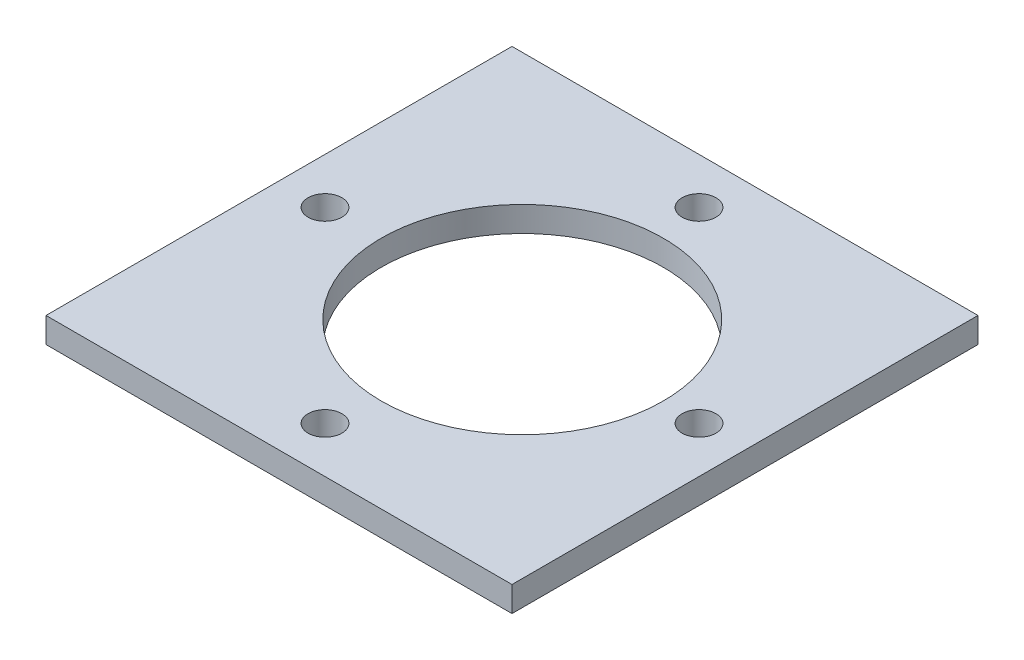
ISO-10303-21;
HEADER;
FILE_DESCRIPTION(('STEP AP214'),'2;1');
FILE_NAME('part.step','',(''),(''),'','','');
FILE_SCHEMA(('AUTOMOTIVE_DESIGN { 1 0 10303 214 1 1 1 1 }'));
ENDSEC;
DATA;
#1=APPLICATION_CONTEXT('core data for automotive mechanical design processes');
#2=APPLICATION_PROTOCOL_DEFINITION('international standard','automotive_design',2000,#1);
#3=PRODUCT_CONTEXT('',#1,'mechanical');
#4=PRODUCT('Part','Part','',(#3));
#5=PRODUCT_RELATED_PRODUCT_CATEGORY('part','',(#4));
#6=PRODUCT_DEFINITION_FORMATION('','',#4);
#7=PRODUCT_DEFINITION_CONTEXT('part definition',#1,'design');
#8=PRODUCT_DEFINITION('design','',#6,#7);
#9=PRODUCT_DEFINITION_SHAPE('','',#8);
#10=(LENGTH_UNIT() NAMED_UNIT(*) SI_UNIT(.MILLI.,.METRE.));
#11=(NAMED_UNIT(*) PLANE_ANGLE_UNIT() SI_UNIT($,.RADIAN.));
#12=(NAMED_UNIT(*) SI_UNIT($,.STERADIAN.) SOLID_ANGLE_UNIT());
#13=UNCERTAINTY_MEASURE_WITH_UNIT(LENGTH_MEASURE(1.E-05),#10,'distance_accuracy_value','');
#14=(GEOMETRIC_REPRESENTATION_CONTEXT(3) GLOBAL_UNCERTAINTY_ASSIGNED_CONTEXT((#13)) GLOBAL_UNIT_ASSIGNED_CONTEXT((#10,
#11,#12)) REPRESENTATION_CONTEXT('',''));
#15=CARTESIAN_POINT('',(0.,0.,0.));
#16=DIRECTION('',(0.,0.,1.));
#17=DIRECTION('',(1.,0.,0.));
#18=AXIS2_PLACEMENT_3D('',#15,#16,#17);
#19=CARTESIAN_POINT('',(0.,4.47,0.));
#20=DIRECTION('',(1.,0.,0.));
#21=DIRECTION('',(0.,0.,-1.));
#22=AXIS2_PLACEMENT_3D('',#19,#20,#21);
#23=PLANE('',#22);
#24=DIRECTION('',(0.,0.,1.));
#25=VECTOR('',#24,1.);
#26=CARTESIAN_POINT('',(0.,0.,0.));
#27=LINE('',#26,#25);
#28=CARTESIAN_POINT('',(0.,0.,-82.6));
#29=VERTEX_POINT('',#28);
#30=CARTESIAN_POINT('',(0.,0.,0.));
#31=VERTEX_POINT('',#30);
#32=EDGE_CURVE('E102',#29,#31,#27,.T.);
#33=ORIENTED_EDGE('',*,*,#32,.T.);
#34=DIRECTION('',(0.,-1.,0.));
#35=VECTOR('',#34,1.);
#36=CARTESIAN_POINT('',(0.,4.47,0.));
#37=LINE('',#36,#35);
#38=CARTESIAN_POINT('',(0.,4.47,0.));
#39=VERTEX_POINT('',#38);
#40=EDGE_CURVE('E11',#39,#31,#37,.T.);
#41=ORIENTED_EDGE('',*,*,#40,.F.);
#42=DIRECTION('',(0.,0.,1.));
#43=VECTOR('',#42,1.);
#44=CARTESIAN_POINT('',(0.,4.47,0.));
#45=LINE('',#44,#43);
#46=CARTESIAN_POINT('',(0.,4.47,-82.6));
#47=VERTEX_POINT('',#46);
#48=EDGE_CURVE('E90',#47,#39,#45,.T.);
#49=ORIENTED_EDGE('',*,*,#48,.F.);
#50=DIRECTION('',(0.,-1.,0.));
#51=VECTOR('',#50,1.);
#52=CARTESIAN_POINT('',(0.,4.47,-82.6));
#53=LINE('',#52,#51);
#54=EDGE_CURVE('E98',#47,#29,#53,.T.);
#55=ORIENTED_EDGE('',*,*,#54,.T.);
#56=EDGE_LOOP('',(#33,#41,#49,#55));
#57=FACE_BOUND('',#56,.T.);
#58=ADVANCED_FACE('F39',(#57),#23,.F.);
#59=CARTESIAN_POINT('',(0.,4.47,0.));
#60=DIRECTION('',(0.,0.,-1.));
#61=DIRECTION('',(-1.,0.,0.));
#62=AXIS2_PLACEMENT_3D('',#59,#60,#61);
#63=PLANE('',#62);
#64=DIRECTION('',(1.,0.,0.));
#65=VECTOR('',#64,1.);
#66=CARTESIAN_POINT('',(0.,0.,0.));
#67=LINE('',#66,#65);
#68=CARTESIAN_POINT('',(82.6,0.,0.));
#69=VERTEX_POINT('',#68);
#70=EDGE_CURVE('E94',#31,#69,#67,.T.);
#71=ORIENTED_EDGE('',*,*,#70,.T.);
#72=DIRECTION('',(0.,-1.,0.));
#73=VECTOR('',#72,1.);
#74=CARTESIAN_POINT('',(82.6,4.47,0.));
#75=LINE('',#74,#73);
#76=CARTESIAN_POINT('',(82.6,4.47,0.));
#77=VERTEX_POINT('',#76);
#78=EDGE_CURVE('E47',#77,#69,#75,.T.);
#79=ORIENTED_EDGE('',*,*,#78,.F.);
#80=DIRECTION('',(1.,0.,0.));
#81=VECTOR('',#80,1.);
#82=CARTESIAN_POINT('',(0.,4.47,0.));
#83=LINE('',#82,#81);
#84=EDGE_CURVE('E85',#39,#77,#83,.T.);
#85=ORIENTED_EDGE('',*,*,#84,.F.);
#86=ORIENTED_EDGE('',*,*,#40,.T.);
#87=EDGE_LOOP('',(#71,#79,#85,#86));
#88=FACE_BOUND('',#87,.T.);
#89=ADVANCED_FACE('F93',(#88),#63,.F.);
#90=CARTESIAN_POINT('',(82.6,4.47,0.));
#91=DIRECTION('',(-1.,0.,0.));
#92=DIRECTION('',(0.,0.,1.));
#93=AXIS2_PLACEMENT_3D('',#90,#91,#92);
#94=PLANE('',#93);
#95=DIRECTION('',(0.,0.,-1.));
#96=VECTOR('',#95,1.);
#97=CARTESIAN_POINT('',(82.6,0.,0.));
#98=LINE('',#97,#96);
#99=CARTESIAN_POINT('',(82.6,0.,-82.6));
#100=VERTEX_POINT('',#99);
#101=EDGE_CURVE('E72',#69,#100,#98,.T.);
#102=ORIENTED_EDGE('',*,*,#101,.T.);
#103=DIRECTION('',(0.,-1.,0.));
#104=VECTOR('',#103,1.);
#105=CARTESIAN_POINT('',(82.6,4.47,-82.6));
#106=LINE('',#105,#104);
#107=CARTESIAN_POINT('',(82.6,4.47,-82.6));
#108=VERTEX_POINT('',#107);
#109=EDGE_CURVE('E95',#108,#100,#106,.T.);
#110=ORIENTED_EDGE('',*,*,#109,.F.);
#111=DIRECTION('',(0.,0.,-1.));
#112=VECTOR('',#111,1.);
#113=CARTESIAN_POINT('',(82.6,4.47,0.));
#114=LINE('',#113,#112);
#115=EDGE_CURVE('E88',#77,#108,#114,.T.);
#116=ORIENTED_EDGE('',*,*,#115,.F.);
#117=ORIENTED_EDGE('',*,*,#78,.T.);
#118=EDGE_LOOP('',(#102,#110,#116,#117));
#119=FACE_BOUND('',#118,.T.);
#120=ADVANCED_FACE('F96',(#119),#94,.F.);
#121=CARTESIAN_POINT('',(0.,4.47,-82.6));
#122=DIRECTION('',(0.,0.,1.));
#123=DIRECTION('',(1.,0.,0.));
#124=AXIS2_PLACEMENT_3D('',#121,#122,#123);
#125=PLANE('',#124);
#126=DIRECTION('',(-1.,0.,0.));
#127=VECTOR('',#126,1.);
#128=CARTESIAN_POINT('',(0.,0.,-82.6));
#129=LINE('',#128,#127);
#130=EDGE_CURVE('E78',#100,#29,#129,.T.);
#131=ORIENTED_EDGE('',*,*,#130,.T.);
#132=ORIENTED_EDGE('',*,*,#54,.F.);
#133=DIRECTION('',(-1.,0.,0.));
#134=VECTOR('',#133,1.);
#135=CARTESIAN_POINT('',(0.,4.47,-82.6));
#136=LINE('',#135,#134);
#137=EDGE_CURVE('E55',#108,#47,#136,.T.);
#138=ORIENTED_EDGE('',*,*,#137,.F.);
#139=ORIENTED_EDGE('',*,*,#109,.T.);
#140=EDGE_LOOP('',(#131,#132,#138,#139));
#141=FACE_BOUND('',#140,.T.);
#142=ADVANCED_FACE('F110',(#141),#125,.F.);
#143=CARTESIAN_POINT('',(0.,4.47,0.));
#144=DIRECTION('',(0.,-1.,0.));
#145=DIRECTION('',(0.,0.,-1.));
#146=AXIS2_PLACEMENT_3D('',#143,#144,#145);
#147=PLANE('',#146);
#148=CARTESIAN_POINT('',(8.15,4.47,-41.3));
#149=DIRECTION('',(0.,1.,0.));
#150=DIRECTION('',(0.,0.,1.));
#151=AXIS2_PLACEMENT_3D('',#148,#149,#150);
#152=CIRCLE('',#151,3.);
#153=CARTESIAN_POINT('',(8.15,4.47,-38.3));
#154=VERTEX_POINT('',#153);
#155=EDGE_CURVE('E140',#154,#154,#152,.T.);
#156=ORIENTED_EDGE('',*,*,#155,.F.);
#157=EDGE_LOOP('',(#156));
#158=FACE_BOUND('',#157,.T.);
#159=CARTESIAN_POINT('',(41.3,4.47,-74.45));
#160=DIRECTION('',(0.,1.,0.));
#161=DIRECTION('',(0.,0.,1.));
#162=AXIS2_PLACEMENT_3D('',#159,#160,#161);
#163=CIRCLE('',#162,3.);
#164=CARTESIAN_POINT('',(41.3,4.47,-71.45));
#165=VERTEX_POINT('',#164);
#166=EDGE_CURVE('E137',#165,#165,#163,.T.);
#167=ORIENTED_EDGE('',*,*,#166,.F.);
#168=EDGE_LOOP('',(#167));
#169=FACE_BOUND('',#168,.T.);
#170=CARTESIAN_POINT('',(74.45,4.47,-41.3));
#171=DIRECTION('',(0.,1.,0.));
#172=DIRECTION('',(0.,0.,1.));
#173=AXIS2_PLACEMENT_3D('',#170,#171,#172);
#174=CIRCLE('',#173,3.00000000000001);
#175=CARTESIAN_POINT('',(74.45,4.47,-38.3));
#176=VERTEX_POINT('',#175);
#177=EDGE_CURVE('E131',#176,#176,#174,.T.);
#178=ORIENTED_EDGE('',*,*,#177,.F.);
#179=EDGE_LOOP('',(#178));
#180=FACE_BOUND('',#179,.T.);
#181=CARTESIAN_POINT('',(41.3,4.47,-8.15));
#182=DIRECTION('',(0.,1.,0.));
#183=DIRECTION('',(0.,0.,1.));
#184=AXIS2_PLACEMENT_3D('',#181,#182,#183);
#185=CIRCLE('',#184,3.);
#186=CARTESIAN_POINT('',(41.3,4.47,-5.15));
#187=VERTEX_POINT('',#186);
#188=EDGE_CURVE('E125',#187,#187,#185,.T.);
#189=ORIENTED_EDGE('',*,*,#188,.F.);
#190=EDGE_LOOP('',(#189));
#191=FACE_BOUND('',#190,.T.);
#192=CARTESIAN_POINT('',(42.8419263891677,4.47,-41.5753439980657));
#193=DIRECTION('',(0.,1.,0.));
#194=DIRECTION('',(0.,0.,1.));
#195=AXIS2_PLACEMENT_3D('',#192,#193,#194);
#196=CIRCLE('',#195,25.);
#197=CARTESIAN_POINT('',(42.8419263891677,4.47,-16.5753439980657));
#198=VERTEX_POINT('',#197);
#199=EDGE_CURVE('E116',#198,#198,#196,.T.);
#200=ORIENTED_EDGE('',*,*,#199,.F.);
#201=EDGE_LOOP('',(#200));
#202=FACE_BOUND('',#201,.T.);
#203=ORIENTED_EDGE('',*,*,#48,.T.);
#204=ORIENTED_EDGE('',*,*,#84,.T.);
#205=ORIENTED_EDGE('',*,*,#115,.T.);
#206=ORIENTED_EDGE('',*,*,#137,.T.);
#207=EDGE_LOOP('',(#203,#204,#205,#206));
#208=FACE_BOUND('',#207,.T.);
#209=ADVANCED_FACE('F86',(#158,#169,#180,#191,#202,#208),#147,.F.);
#210=CARTESIAN_POINT('',(0.,0.,0.));
#211=DIRECTION('',(0.,-1.,0.));
#212=DIRECTION('',(0.,0.,-1.));
#213=AXIS2_PLACEMENT_3D('',#210,#211,#212);
#214=PLANE('',#213);
#215=CARTESIAN_POINT('',(8.15,0.,-41.3));
#216=DIRECTION('',(0.,1.,0.));
#217=DIRECTION('',(0.,0.,1.));
#218=AXIS2_PLACEMENT_3D('',#215,#216,#217);
#219=CIRCLE('',#218,3.);
#220=CARTESIAN_POINT('',(8.15,0.,-38.3));
#221=VERTEX_POINT('',#220);
#222=EDGE_CURVE('E119',#221,#221,#219,.T.);
#223=ORIENTED_EDGE('',*,*,#222,.T.);
#224=EDGE_LOOP('',(#223));
#225=FACE_BOUND('',#224,.T.);
#226=CARTESIAN_POINT('',(41.3,0.,-74.45));
#227=DIRECTION('',(0.,1.,0.));
#228=DIRECTION('',(0.,0.,1.));
#229=AXIS2_PLACEMENT_3D('',#226,#227,#228);
#230=CIRCLE('',#229,3.);
#231=CARTESIAN_POINT('',(41.3,0.,-71.45));
#232=VERTEX_POINT('',#231);
#233=EDGE_CURVE('E134',#232,#232,#230,.T.);
#234=ORIENTED_EDGE('',*,*,#233,.T.);
#235=EDGE_LOOP('',(#234));
#236=FACE_BOUND('',#235,.T.);
#237=CARTESIAN_POINT('',(74.45,0.,-41.3));
#238=DIRECTION('',(0.,1.,0.));
#239=DIRECTION('',(0.,0.,1.));
#240=AXIS2_PLACEMENT_3D('',#237,#238,#239);
#241=CIRCLE('',#240,3.00000000000001);
#242=CARTESIAN_POINT('',(74.45,0.,-38.3));
#243=VERTEX_POINT('',#242);
#244=EDGE_CURVE('E128',#243,#243,#241,.T.);
#245=ORIENTED_EDGE('',*,*,#244,.T.);
#246=EDGE_LOOP('',(#245));
#247=FACE_BOUND('',#246,.T.);
#248=CARTESIAN_POINT('',(41.3,0.,-8.15));
#249=DIRECTION('',(0.,1.,0.));
#250=DIRECTION('',(0.,0.,1.));
#251=AXIS2_PLACEMENT_3D('',#248,#249,#250);
#252=CIRCLE('',#251,3.);
#253=CARTESIAN_POINT('',(41.3,0.,-5.15));
#254=VERTEX_POINT('',#253);
#255=EDGE_CURVE('E122',#254,#254,#252,.T.);
#256=ORIENTED_EDGE('',*,*,#255,.T.);
#257=EDGE_LOOP('',(#256));
#258=FACE_BOUND('',#257,.T.);
#259=CARTESIAN_POINT('',(42.8419263891677,0.,-41.5753439980657));
#260=DIRECTION('',(0.,1.,0.));
#261=DIRECTION('',(0.,0.,1.));
#262=AXIS2_PLACEMENT_3D('',#259,#260,#261);
#263=CIRCLE('',#262,25.);
#264=CARTESIAN_POINT('',(42.8419263891677,0.,-16.5753439980657));
#265=VERTEX_POINT('',#264);
#266=EDGE_CURVE('E105',#265,#265,#263,.T.);
#267=ORIENTED_EDGE('',*,*,#266,.T.);
#268=EDGE_LOOP('',(#267));
#269=FACE_BOUND('',#268,.T.);
#270=ORIENTED_EDGE('',*,*,#32,.F.);
#271=ORIENTED_EDGE('',*,*,#130,.F.);
#272=ORIENTED_EDGE('',*,*,#101,.F.);
#273=ORIENTED_EDGE('',*,*,#70,.F.);
#274=EDGE_LOOP('',(#270,#271,#272,#273));
#275=FACE_BOUND('',#274,.T.);
#276=ADVANCED_FACE('F113',(#225,#236,#247,#258,#269,#275),#214,.T.);
#277=CARTESIAN_POINT('',(42.8419263891677,0.,-41.5753439980657));
#278=DIRECTION('',(0.,1.,0.));
#279=DIRECTION('',(0.,0.,1.));
#280=AXIS2_PLACEMENT_3D('',#277,#278,#279);
#281=CYLINDRICAL_SURFACE('',#280,25.);
#282=ORIENTED_EDGE('',*,*,#266,.F.);
#283=EDGE_LOOP('',(#282));
#284=FACE_BOUND('',#283,.T.);
#285=ORIENTED_EDGE('',*,*,#199,.T.);
#286=EDGE_LOOP('',(#285));
#287=FACE_BOUND('',#286,.T.);
#288=ADVANCED_FACE('F166',(#284,#287),#281,.F.);
#289=CARTESIAN_POINT('',(41.3,0.,-8.15));
#290=DIRECTION('',(0.,1.,0.));
#291=DIRECTION('',(0.,0.,1.));
#292=AXIS2_PLACEMENT_3D('',#289,#290,#291);
#293=CYLINDRICAL_SURFACE('',#292,3.);
#294=ORIENTED_EDGE('',*,*,#255,.F.);
#295=EDGE_LOOP('',(#294));
#296=FACE_BOUND('',#295,.T.);
#297=ORIENTED_EDGE('',*,*,#188,.T.);
#298=EDGE_LOOP('',(#297));
#299=FACE_BOUND('',#298,.T.);
#300=ADVANCED_FACE('F168',(#296,#299),#293,.F.);
#301=CARTESIAN_POINT('',(74.45,0.,-41.3));
#302=DIRECTION('',(0.,1.,0.));
#303=DIRECTION('',(0.,0.,1.));
#304=AXIS2_PLACEMENT_3D('',#301,#302,#303);
#305=CYLINDRICAL_SURFACE('',#304,3.00000000000001);
#306=ORIENTED_EDGE('',*,*,#244,.F.);
#307=EDGE_LOOP('',(#306));
#308=FACE_BOUND('',#307,.T.);
#309=ORIENTED_EDGE('',*,*,#177,.T.);
#310=EDGE_LOOP('',(#309));
#311=FACE_BOUND('',#310,.T.);
#312=ADVANCED_FACE('F175',(#308,#311),#305,.F.);
#313=CARTESIAN_POINT('',(41.3,0.,-74.45));
#314=DIRECTION('',(0.,1.,0.));
#315=DIRECTION('',(0.,0.,1.));
#316=AXIS2_PLACEMENT_3D('',#313,#314,#315);
#317=CYLINDRICAL_SURFACE('',#316,3.);
#318=ORIENTED_EDGE('',*,*,#233,.F.);
#319=EDGE_LOOP('',(#318));
#320=FACE_BOUND('',#319,.T.);
#321=ORIENTED_EDGE('',*,*,#166,.T.);
#322=EDGE_LOOP('',(#321));
#323=FACE_BOUND('',#322,.T.);
#324=ADVANCED_FACE('F151',(#320,#323),#317,.F.);
#325=CARTESIAN_POINT('',(8.15,0.,-41.3));
#326=DIRECTION('',(0.,1.,0.));
#327=DIRECTION('',(0.,0.,1.));
#328=AXIS2_PLACEMENT_3D('',#325,#326,#327);
#329=CYLINDRICAL_SURFACE('',#328,3.);
#330=ORIENTED_EDGE('',*,*,#222,.F.);
#331=EDGE_LOOP('',(#330));
#332=FACE_BOUND('',#331,.T.);
#333=ORIENTED_EDGE('',*,*,#155,.T.);
#334=EDGE_LOOP('',(#333));
#335=FACE_BOUND('',#334,.T.);
#336=ADVANCED_FACE('F148',(#332,#335),#329,.F.);
#337=CLOSED_SHELL('',(#58,#89,#120,#142,#209,#276,#288,#300,#312,#324,#336));
#338=MANIFOLD_SOLID_BREP('B2',#337);
#339=ADVANCED_BREP_SHAPE_REPRESENTATION('',(#18,#338),#14);
#340=SHAPE_DEFINITION_REPRESENTATION(#9,#339);
ENDSEC;
END-ISO-10303-21;
